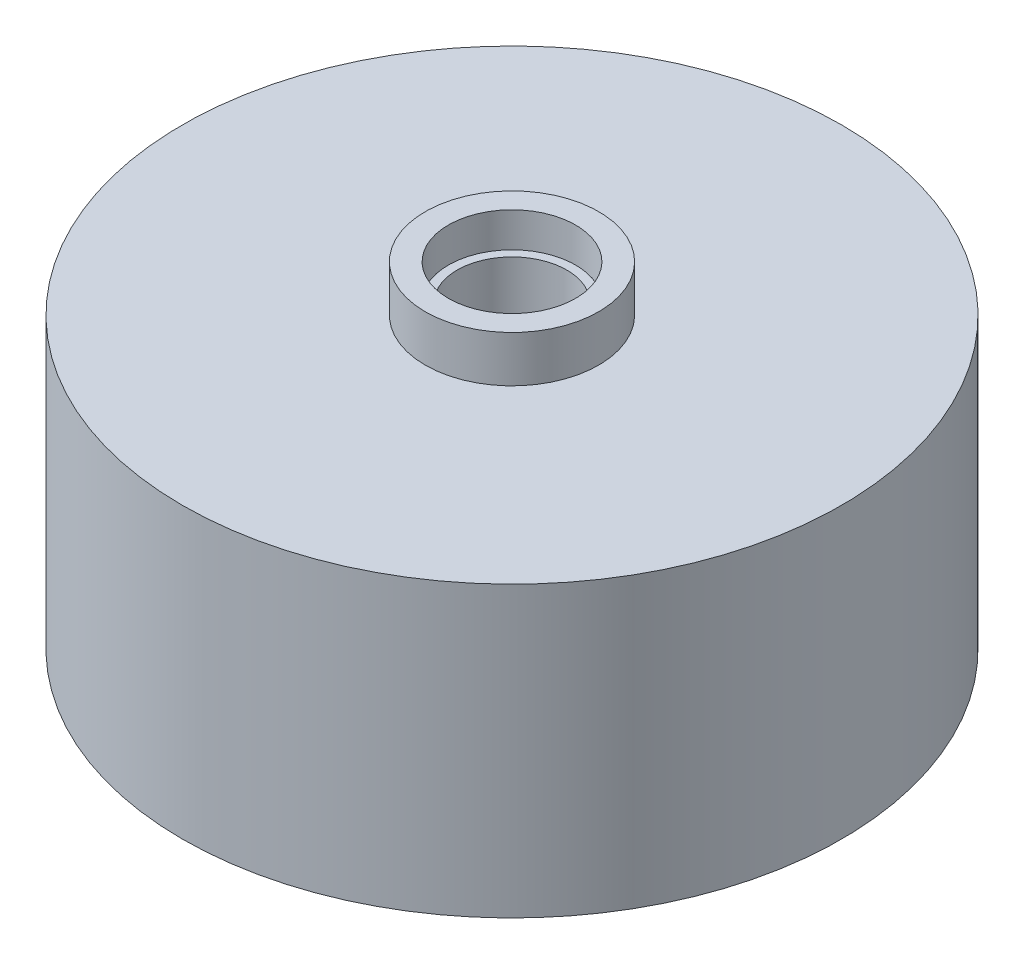
ISO-10303-21;
HEADER;
FILE_DESCRIPTION(('STEP AP214'),'2;1');
FILE_NAME('part.step','',(''),(''),'','','');
FILE_SCHEMA(('AUTOMOTIVE_DESIGN { 1 0 10303 214 1 1 1 1 }'));
ENDSEC;
DATA;
#1=APPLICATION_CONTEXT('core data for automotive mechanical design processes');
#2=APPLICATION_PROTOCOL_DEFINITION('international standard','automotive_design',2000,#1);
#3=PRODUCT_CONTEXT('',#1,'mechanical');
#4=PRODUCT('Part','Part','',(#3));
#5=PRODUCT_RELATED_PRODUCT_CATEGORY('part','',(#4));
#6=PRODUCT_DEFINITION_FORMATION('','',#4);
#7=PRODUCT_DEFINITION_CONTEXT('part definition',#1,'design');
#8=PRODUCT_DEFINITION('design','',#6,#7);
#9=PRODUCT_DEFINITION_SHAPE('','',#8);
#10=(LENGTH_UNIT() NAMED_UNIT(*) SI_UNIT(.MILLI.,.METRE.));
#11=(NAMED_UNIT(*) PLANE_ANGLE_UNIT() SI_UNIT($,.RADIAN.));
#12=(NAMED_UNIT(*) SI_UNIT($,.STERADIAN.) SOLID_ANGLE_UNIT());
#13=UNCERTAINTY_MEASURE_WITH_UNIT(LENGTH_MEASURE(1.E-05),#10,'distance_accuracy_value','');
#14=(GEOMETRIC_REPRESENTATION_CONTEXT(3) GLOBAL_UNCERTAINTY_ASSIGNED_CONTEXT((#13)) GLOBAL_UNIT_ASSIGNED_CONTEXT((#10,
#11,#12)) REPRESENTATION_CONTEXT('',''));
#15=CARTESIAN_POINT('',(0.,0.,0.));
#16=DIRECTION('',(0.,0.,1.));
#17=DIRECTION('',(1.,0.,0.));
#18=AXIS2_PLACEMENT_3D('',#15,#16,#17);
#19=CARTESIAN_POINT('',(0.,-12.5,0.));
#20=DIRECTION('',(0.,1.,0.));
#21=DIRECTION('',(0.,0.,1.));
#22=AXIS2_PLACEMENT_3D('',#19,#20,#21);
#23=CYLINDRICAL_SURFACE('',#22,4.75);
#24=CARTESIAN_POINT('',(0.,13.5,0.));
#25=DIRECTION('',(0.,1.,0.));
#26=DIRECTION('',(0.,0.,1.));
#27=AXIS2_PLACEMENT_3D('',#24,#25,#26);
#28=CIRCLE('',#27,4.75);
#29=CARTESIAN_POINT('',(0.,13.5,4.75));
#30=VERTEX_POINT('',#29);
#31=EDGE_CURVE('E50',#30,#30,#28,.F.);
#32=ORIENTED_EDGE('',*,*,#31,.F.);
#33=EDGE_LOOP('',(#32));
#34=FACE_BOUND('',#33,.T.);
#35=CARTESIAN_POINT('',(0.,-13.5,0.));
#36=DIRECTION('',(0.,-1.,0.));
#37=DIRECTION('',(0.,0.,-1.));
#38=AXIS2_PLACEMENT_3D('',#35,#36,#37);
#39=CIRCLE('',#38,4.75);
#40=CARTESIAN_POINT('',(0.,-13.5,-4.75));
#41=VERTEX_POINT('',#40);
#42=EDGE_CURVE('E38',#41,#41,#39,.F.);
#43=ORIENTED_EDGE('',*,*,#42,.F.);
#44=EDGE_LOOP('',(#43));
#45=FACE_BOUND('',#44,.T.);
#46=ADVANCED_FACE('F34',(#34,#45),#23,.F.);
#47=CARTESIAN_POINT('',(0.,-12.5,0.));
#48=DIRECTION('',(0.,1.,0.));
#49=DIRECTION('',(0.,0.,1.));
#50=AXIS2_PLACEMENT_3D('',#47,#48,#49);
#51=PLANE('',#50);
#52=CARTESIAN_POINT('',(0.,-12.5,0.));
#53=DIRECTION('',(0.,1.,0.));
#54=DIRECTION('',(0.,0.,1.));
#55=AXIS2_PLACEMENT_3D('',#52,#53,#54);
#56=CIRCLE('',#55,28.5);
#57=CARTESIAN_POINT('',(0.,-12.5,28.5));
#58=VERTEX_POINT('',#57);
#59=EDGE_CURVE('E42',#58,#58,#56,.T.);
#60=ORIENTED_EDGE('',*,*,#59,.F.);
#61=EDGE_LOOP('',(#60));
#62=FACE_BOUND('',#61,.T.);
#63=CARTESIAN_POINT('',(0.,-12.5,0.));
#64=DIRECTION('',(0.,1.,0.));
#65=DIRECTION('',(0.,0.,1.));
#66=AXIS2_PLACEMENT_3D('',#63,#64,#65);
#67=CIRCLE('',#66,7.5);
#68=CARTESIAN_POINT('',(0.,-12.5,7.5));
#69=VERTEX_POINT('',#68);
#70=EDGE_CURVE('E10',#69,#69,#67,.F.);
#71=ORIENTED_EDGE('',*,*,#70,.F.);
#72=EDGE_LOOP('',(#71));
#73=FACE_BOUND('',#72,.T.);
#74=ADVANCED_FACE('F90',(#62,#73),#51,.F.);
#75=CARTESIAN_POINT('',(0.,12.5,0.));
#76=DIRECTION('',(0.,1.,0.));
#77=DIRECTION('',(0.,0.,1.));
#78=AXIS2_PLACEMENT_3D('',#75,#76,#77);
#79=PLANE('',#78);
#80=CARTESIAN_POINT('',(0.,12.5,0.));
#81=DIRECTION('',(0.,1.,0.));
#82=DIRECTION('',(0.,0.,1.));
#83=AXIS2_PLACEMENT_3D('',#80,#81,#82);
#84=CIRCLE('',#83,28.5);
#85=CARTESIAN_POINT('',(0.,12.5,28.5));
#86=VERTEX_POINT('',#85);
#87=EDGE_CURVE('E47',#86,#86,#84,.T.);
#88=ORIENTED_EDGE('',*,*,#87,.T.);
#89=EDGE_LOOP('',(#88));
#90=FACE_BOUND('',#89,.T.);
#91=CARTESIAN_POINT('',(0.,12.5,0.));
#92=DIRECTION('',(0.,1.,0.));
#93=DIRECTION('',(0.,0.,1.));
#94=AXIS2_PLACEMENT_3D('',#91,#92,#93);
#95=CIRCLE('',#94,7.5);
#96=CARTESIAN_POINT('',(0.,12.5,7.5));
#97=VERTEX_POINT('',#96);
#98=EDGE_CURVE('E57',#97,#97,#95,.T.);
#99=ORIENTED_EDGE('',*,*,#98,.F.);
#100=EDGE_LOOP('',(#99));
#101=FACE_BOUND('',#100,.T.);
#102=ADVANCED_FACE('F77',(#90,#101),#79,.T.);
#103=CARTESIAN_POINT('',(0.,-12.5,0.));
#104=DIRECTION('',(0.,1.,0.));
#105=DIRECTION('',(0.,0.,1.));
#106=AXIS2_PLACEMENT_3D('',#103,#104,#105);
#107=CYLINDRICAL_SURFACE('',#106,28.5);
#108=ORIENTED_EDGE('',*,*,#59,.T.);
#109=EDGE_LOOP('',(#108));
#110=FACE_BOUND('',#109,.T.);
#111=ORIENTED_EDGE('',*,*,#87,.F.);
#112=EDGE_LOOP('',(#111));
#113=FACE_BOUND('',#112,.T.);
#114=ADVANCED_FACE('F36',(#110,#113),#107,.T.);
#115=CARTESIAN_POINT('',(0.,16.5,0.));
#116=DIRECTION('',(0.,1.,0.));
#117=DIRECTION('',(0.,0.,1.));
#118=AXIS2_PLACEMENT_3D('',#115,#116,#117);
#119=PLANE('',#118);
#120=CARTESIAN_POINT('',(0.,16.5,0.));
#121=DIRECTION('',(0.,1.,0.));
#122=DIRECTION('',(0.,0.,1.));
#123=AXIS2_PLACEMENT_3D('',#120,#121,#122);
#124=CIRCLE('',#123,5.5);
#125=CARTESIAN_POINT('',(0.,16.5,5.5));
#126=VERTEX_POINT('',#125);
#127=EDGE_CURVE('E60',#126,#126,#124,.T.);
#128=ORIENTED_EDGE('',*,*,#127,.F.);
#129=EDGE_LOOP('',(#128));
#130=FACE_BOUND('',#129,.T.);
#131=CARTESIAN_POINT('',(0.,16.5,0.));
#132=DIRECTION('',(0.,1.,0.));
#133=DIRECTION('',(0.,0.,1.));
#134=AXIS2_PLACEMENT_3D('',#131,#132,#133);
#135=CIRCLE('',#134,7.5);
#136=CARTESIAN_POINT('',(0.,16.5,7.5));
#137=VERTEX_POINT('',#136);
#138=EDGE_CURVE('E70',#137,#137,#135,.T.);
#139=ORIENTED_EDGE('',*,*,#138,.T.);
#140=EDGE_LOOP('',(#139));
#141=FACE_BOUND('',#140,.T.);
#142=ADVANCED_FACE('F81',(#130,#141),#119,.T.);
#143=CARTESIAN_POINT('',(0.,16.5,0.));
#144=DIRECTION('',(0.,-1.,0.));
#145=DIRECTION('',(0.,0.,-1.));
#146=AXIS2_PLACEMENT_3D('',#143,#144,#145);
#147=CYLINDRICAL_SURFACE('',#146,7.5);
#148=ORIENTED_EDGE('',*,*,#138,.F.);
#149=EDGE_LOOP('',(#148));
#150=FACE_BOUND('',#149,.T.);
#151=ORIENTED_EDGE('',*,*,#98,.T.);
#152=EDGE_LOOP('',(#151));
#153=FACE_BOUND('',#152,.T.);
#154=ADVANCED_FACE('F87',(#150,#153),#147,.T.);
#155=CARTESIAN_POINT('',(0.,-16.5,0.));
#156=DIRECTION('',(0.,-1.,0.));
#157=DIRECTION('',(0.,0.,-1.));
#158=AXIS2_PLACEMENT_3D('',#155,#156,#157);
#159=PLANE('',#158);
#160=CARTESIAN_POINT('',(0.,-16.5,0.));
#161=DIRECTION('',(0.,-1.,0.));
#162=DIRECTION('',(0.,0.,-1.));
#163=AXIS2_PLACEMENT_3D('',#160,#161,#162);
#164=CIRCLE('',#163,5.5);
#165=CARTESIAN_POINT('',(0.,-16.5,-5.5));
#166=VERTEX_POINT('',#165);
#167=EDGE_CURVE('E67',#166,#166,#164,.T.);
#168=ORIENTED_EDGE('',*,*,#167,.F.);
#169=EDGE_LOOP('',(#168));
#170=FACE_BOUND('',#169,.T.);
#171=CARTESIAN_POINT('',(0.,-16.5,0.));
#172=DIRECTION('',(0.,-1.,0.));
#173=DIRECTION('',(0.,0.,-1.));
#174=AXIS2_PLACEMENT_3D('',#171,#172,#173);
#175=CIRCLE('',#174,7.5);
#176=CARTESIAN_POINT('',(0.,-16.5,-7.5));
#177=VERTEX_POINT('',#176);
#178=EDGE_CURVE('E52',#177,#177,#175,.T.);
#179=ORIENTED_EDGE('',*,*,#178,.T.);
#180=EDGE_LOOP('',(#179));
#181=FACE_BOUND('',#180,.T.);
#182=ADVANCED_FACE('F102',(#170,#181),#159,.T.);
#183=CARTESIAN_POINT('',(0.,-16.5,0.));
#184=DIRECTION('',(0.,1.,0.));
#185=DIRECTION('',(0.,0.,1.));
#186=AXIS2_PLACEMENT_3D('',#183,#184,#185);
#187=CYLINDRICAL_SURFACE('',#186,7.5);
#188=ORIENTED_EDGE('',*,*,#178,.F.);
#189=EDGE_LOOP('',(#188));
#190=FACE_BOUND('',#189,.T.);
#191=ORIENTED_EDGE('',*,*,#70,.T.);
#192=EDGE_LOOP('',(#191));
#193=FACE_BOUND('',#192,.T.);
#194=ADVANCED_FACE('F105',(#190,#193),#187,.T.);
#195=CARTESIAN_POINT('',(0.,13.5,0.));
#196=DIRECTION('',(0.,1.,0.));
#197=DIRECTION('',(0.,0.,1.));
#198=AXIS2_PLACEMENT_3D('',#195,#196,#197);
#199=PLANE('',#198);
#200=CARTESIAN_POINT('',(0.,13.5,0.));
#201=DIRECTION('',(0.,1.,0.));
#202=DIRECTION('',(0.,0.,1.));
#203=AXIS2_PLACEMENT_3D('',#200,#201,#202);
#204=CIRCLE('',#203,5.5);
#205=CARTESIAN_POINT('',(0.,13.5,5.5));
#206=VERTEX_POINT('',#205);
#207=EDGE_CURVE('E53',#206,#206,#204,.T.);
#208=ORIENTED_EDGE('',*,*,#207,.T.);
#209=EDGE_LOOP('',(#208));
#210=FACE_BOUND('',#209,.T.);
#211=ORIENTED_EDGE('',*,*,#31,.T.);
#212=EDGE_LOOP('',(#211));
#213=FACE_BOUND('',#212,.T.);
#214=ADVANCED_FACE('F108',(#210,#213),#199,.T.);
#215=CARTESIAN_POINT('',(0.,13.5,0.));
#216=DIRECTION('',(0.,1.,0.));
#217=DIRECTION('',(0.,0.,1.));
#218=AXIS2_PLACEMENT_3D('',#215,#216,#217);
#219=CYLINDRICAL_SURFACE('',#218,5.5);
#220=ORIENTED_EDGE('',*,*,#207,.F.);
#221=EDGE_LOOP('',(#220));
#222=FACE_BOUND('',#221,.T.);
#223=ORIENTED_EDGE('',*,*,#127,.T.);
#224=EDGE_LOOP('',(#223));
#225=FACE_BOUND('',#224,.T.);
#226=ADVANCED_FACE('F113',(#222,#225),#219,.F.);
#227=CARTESIAN_POINT('',(0.,-13.5,0.));
#228=DIRECTION('',(0.,-1.,0.));
#229=DIRECTION('',(0.,0.,-1.));
#230=AXIS2_PLACEMENT_3D('',#227,#228,#229);
#231=PLANE('',#230);
#232=CARTESIAN_POINT('',(0.,-13.5,0.));
#233=DIRECTION('',(0.,-1.,0.));
#234=DIRECTION('',(0.,0.,-1.));
#235=AXIS2_PLACEMENT_3D('',#232,#233,#234);
#236=CIRCLE('',#235,5.5);
#237=CARTESIAN_POINT('',(0.,-13.5,-5.5));
#238=VERTEX_POINT('',#237);
#239=EDGE_CURVE('E131',#238,#238,#236,.T.);
#240=ORIENTED_EDGE('',*,*,#239,.T.);
#241=EDGE_LOOP('',(#240));
#242=FACE_BOUND('',#241,.T.);
#243=ORIENTED_EDGE('',*,*,#42,.T.);
#244=EDGE_LOOP('',(#243));
#245=FACE_BOUND('',#244,.T.);
#246=ADVANCED_FACE('F116',(#242,#245),#231,.T.);
#247=CARTESIAN_POINT('',(0.,-13.5,0.));
#248=DIRECTION('',(0.,-1.,0.));
#249=DIRECTION('',(0.,0.,-1.));
#250=AXIS2_PLACEMENT_3D('',#247,#248,#249);
#251=CYLINDRICAL_SURFACE('',#250,5.5);
#252=ORIENTED_EDGE('',*,*,#239,.F.);
#253=EDGE_LOOP('',(#252));
#254=FACE_BOUND('',#253,.T.);
#255=ORIENTED_EDGE('',*,*,#167,.T.);
#256=EDGE_LOOP('',(#255));
#257=FACE_BOUND('',#256,.T.);
#258=ADVANCED_FACE('F120',(#254,#257),#251,.F.);
#259=CLOSED_SHELL('',(#46,#74,#102,#114,#142,#154,#182,#194,#214,#226,#246,#258));
#260=MANIFOLD_SOLID_BREP('B2',#259);
#261=ADVANCED_BREP_SHAPE_REPRESENTATION('',(#18,#260),#14);
#262=SHAPE_DEFINITION_REPRESENTATION(#9,#261);
ENDSEC;
END-ISO-10303-21;
